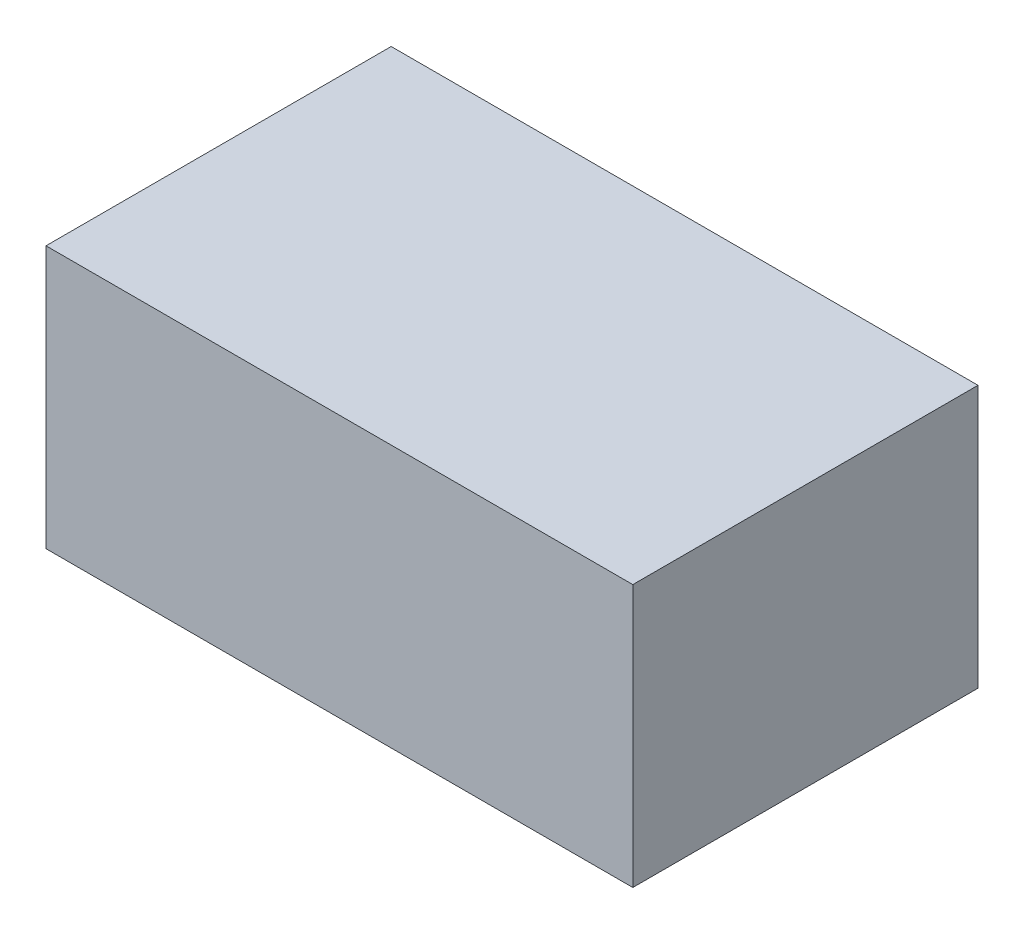
ISO-10303-21;
HEADER;
FILE_DESCRIPTION(('STEP AP214'),'2;1');
FILE_NAME('part.step','',(''),(''),'','','');
FILE_SCHEMA(('AUTOMOTIVE_DESIGN { 1 0 10303 214 1 1 1 1 }'));
ENDSEC;
DATA;
#1=APPLICATION_CONTEXT('core data for automotive mechanical design processes');
#2=APPLICATION_PROTOCOL_DEFINITION('international standard','automotive_design',2000,#1);
#3=PRODUCT_CONTEXT('',#1,'mechanical');
#4=PRODUCT('Part','Part','',(#3));
#5=PRODUCT_RELATED_PRODUCT_CATEGORY('part','',(#4));
#6=PRODUCT_DEFINITION_FORMATION('','',#4);
#7=PRODUCT_DEFINITION_CONTEXT('part definition',#1,'design');
#8=PRODUCT_DEFINITION('design','',#6,#7);
#9=PRODUCT_DEFINITION_SHAPE('','',#8);
#10=(LENGTH_UNIT() NAMED_UNIT(*) SI_UNIT(.MILLI.,.METRE.));
#11=(NAMED_UNIT(*) PLANE_ANGLE_UNIT() SI_UNIT($,.RADIAN.));
#12=(NAMED_UNIT(*) SI_UNIT($,.STERADIAN.) SOLID_ANGLE_UNIT());
#13=UNCERTAINTY_MEASURE_WITH_UNIT(LENGTH_MEASURE(1.E-05),#10,'distance_accuracy_value','');
#14=(GEOMETRIC_REPRESENTATION_CONTEXT(3) GLOBAL_UNCERTAINTY_ASSIGNED_CONTEXT((#13)) GLOBAL_UNIT_ASSIGNED_CONTEXT((#10,
#11,#12)) REPRESENTATION_CONTEXT('',''));
#15=CARTESIAN_POINT('',(0.,0.,0.));
#16=DIRECTION('',(0.,0.,1.));
#17=DIRECTION('',(1.,0.,0.));
#18=AXIS2_PLACEMENT_3D('',#15,#16,#17);
#19=CARTESIAN_POINT('',(0.,12.065,0.));
#20=DIRECTION('',(1.,0.,0.));
#21=DIRECTION('',(0.,0.,-1.));
#22=AXIS2_PLACEMENT_3D('',#19,#20,#21);
#23=PLANE('',#22);
#24=DIRECTION('',(0.,0.,1.));
#25=VECTOR('',#24,1.);
#26=CARTESIAN_POINT('',(0.,-12.065,0.));
#27=LINE('',#26,#25);
#28=CARTESIAN_POINT('',(0.,-12.065,-31.75));
#29=VERTEX_POINT('',#28);
#30=CARTESIAN_POINT('',(0.,-12.065,0.));
#31=VERTEX_POINT('',#30);
#32=EDGE_CURVE('E100',#29,#31,#27,.T.);
#33=ORIENTED_EDGE('',*,*,#32,.T.);
#34=DIRECTION('',(0.,-1.,0.));
#35=VECTOR('',#34,1.);
#36=CARTESIAN_POINT('',(0.,12.065,0.));
#37=LINE('',#36,#35);
#38=CARTESIAN_POINT('',(0.,12.065,0.));
#39=VERTEX_POINT('',#38);
#40=EDGE_CURVE('E11',#39,#31,#37,.T.);
#41=ORIENTED_EDGE('',*,*,#40,.F.);
#42=DIRECTION('',(0.,0.,1.));
#43=VECTOR('',#42,1.);
#44=CARTESIAN_POINT('',(0.,12.065,0.));
#45=LINE('',#44,#43);
#46=CARTESIAN_POINT('',(0.,12.065,-31.75));
#47=VERTEX_POINT('',#46);
#48=EDGE_CURVE('E88',#47,#39,#45,.T.);
#49=ORIENTED_EDGE('',*,*,#48,.F.);
#50=DIRECTION('',(0.,-1.,0.));
#51=VECTOR('',#50,1.);
#52=CARTESIAN_POINT('',(0.,12.065,-31.75));
#53=LINE('',#52,#51);
#54=EDGE_CURVE('E96',#47,#29,#53,.T.);
#55=ORIENTED_EDGE('',*,*,#54,.T.);
#56=EDGE_LOOP('',(#33,#41,#49,#55));
#57=FACE_BOUND('',#56,.T.);
#58=ADVANCED_FACE('F37',(#57),#23,.F.);
#59=CARTESIAN_POINT('',(0.,12.065,0.));
#60=DIRECTION('',(0.,0.,-1.));
#61=DIRECTION('',(-1.,0.,0.));
#62=AXIS2_PLACEMENT_3D('',#59,#60,#61);
#63=PLANE('',#62);
#64=DIRECTION('',(1.,0.,0.));
#65=VECTOR('',#64,1.);
#66=CARTESIAN_POINT('',(0.,-12.065,0.));
#67=LINE('',#66,#65);
#68=CARTESIAN_POINT('',(53.975,-12.065,0.));
#69=VERTEX_POINT('',#68);
#70=EDGE_CURVE('E92',#31,#69,#67,.T.);
#71=ORIENTED_EDGE('',*,*,#70,.T.);
#72=DIRECTION('',(0.,-1.,0.));
#73=VECTOR('',#72,1.);
#74=CARTESIAN_POINT('',(53.975,12.065,0.));
#75=LINE('',#74,#73);
#76=CARTESIAN_POINT('',(53.975,12.065,0.));
#77=VERTEX_POINT('',#76);
#78=EDGE_CURVE('E45',#77,#69,#75,.T.);
#79=ORIENTED_EDGE('',*,*,#78,.F.);
#80=DIRECTION('',(1.,0.,0.));
#81=VECTOR('',#80,1.);
#82=CARTESIAN_POINT('',(0.,12.065,0.));
#83=LINE('',#82,#81);
#84=EDGE_CURVE('E83',#39,#77,#83,.T.);
#85=ORIENTED_EDGE('',*,*,#84,.F.);
#86=ORIENTED_EDGE('',*,*,#40,.T.);
#87=EDGE_LOOP('',(#71,#79,#85,#86));
#88=FACE_BOUND('',#87,.T.);
#89=ADVANCED_FACE('F91',(#88),#63,.F.);
#90=CARTESIAN_POINT('',(53.975,12.065,0.));
#91=DIRECTION('',(-1.,0.,0.));
#92=DIRECTION('',(0.,0.,1.));
#93=AXIS2_PLACEMENT_3D('',#90,#91,#92);
#94=PLANE('',#93);
#95=DIRECTION('',(0.,0.,-1.));
#96=VECTOR('',#95,1.);
#97=CARTESIAN_POINT('',(53.975,-12.065,0.));
#98=LINE('',#97,#96);
#99=CARTESIAN_POINT('',(53.975,-12.065,-31.75));
#100=VERTEX_POINT('',#99);
#101=EDGE_CURVE('E70',#69,#100,#98,.T.);
#102=ORIENTED_EDGE('',*,*,#101,.T.);
#103=DIRECTION('',(0.,-1.,0.));
#104=VECTOR('',#103,1.);
#105=CARTESIAN_POINT('',(53.975,12.065,-31.75));
#106=LINE('',#105,#104);
#107=CARTESIAN_POINT('',(53.975,12.065,-31.75));
#108=VERTEX_POINT('',#107);
#109=EDGE_CURVE('E93',#108,#100,#106,.T.);
#110=ORIENTED_EDGE('',*,*,#109,.F.);
#111=DIRECTION('',(0.,0.,-1.));
#112=VECTOR('',#111,1.);
#113=CARTESIAN_POINT('',(53.975,12.065,0.));
#114=LINE('',#113,#112);
#115=EDGE_CURVE('E86',#77,#108,#114,.T.);
#116=ORIENTED_EDGE('',*,*,#115,.F.);
#117=ORIENTED_EDGE('',*,*,#78,.T.);
#118=EDGE_LOOP('',(#102,#110,#116,#117));
#119=FACE_BOUND('',#118,.T.);
#120=ADVANCED_FACE('F94',(#119),#94,.F.);
#121=CARTESIAN_POINT('',(0.,12.065,-31.75));
#122=DIRECTION('',(0.,0.,1.));
#123=DIRECTION('',(1.,0.,0.));
#124=AXIS2_PLACEMENT_3D('',#121,#122,#123);
#125=PLANE('',#124);
#126=DIRECTION('',(-1.,0.,0.));
#127=VECTOR('',#126,1.);
#128=CARTESIAN_POINT('',(0.,-12.065,-31.75));
#129=LINE('',#128,#127);
#130=EDGE_CURVE('E76',#100,#29,#129,.T.);
#131=ORIENTED_EDGE('',*,*,#130,.T.);
#132=ORIENTED_EDGE('',*,*,#54,.F.);
#133=DIRECTION('',(-1.,0.,0.));
#134=VECTOR('',#133,1.);
#135=CARTESIAN_POINT('',(0.,12.065,-31.75));
#136=LINE('',#135,#134);
#137=EDGE_CURVE('E53',#108,#47,#136,.T.);
#138=ORIENTED_EDGE('',*,*,#137,.F.);
#139=ORIENTED_EDGE('',*,*,#109,.T.);
#140=EDGE_LOOP('',(#131,#132,#138,#139));
#141=FACE_BOUND('',#140,.T.);
#142=ADVANCED_FACE('F107',(#141),#125,.F.);
#143=CARTESIAN_POINT('',(0.,12.065,0.));
#144=DIRECTION('',(0.,-1.,0.));
#145=DIRECTION('',(0.,0.,-1.));
#146=AXIS2_PLACEMENT_3D('',#143,#144,#145);
#147=PLANE('',#146);
#148=ORIENTED_EDGE('',*,*,#48,.T.);
#149=ORIENTED_EDGE('',*,*,#84,.T.);
#150=ORIENTED_EDGE('',*,*,#115,.T.);
#151=ORIENTED_EDGE('',*,*,#137,.T.);
#152=EDGE_LOOP('',(#148,#149,#150,#151));
#153=FACE_BOUND('',#152,.T.);
#154=ADVANCED_FACE('F84',(#153),#147,.F.);
#155=CARTESIAN_POINT('',(0.,-12.065,0.));
#156=DIRECTION('',(0.,-1.,0.));
#157=DIRECTION('',(0.,0.,-1.));
#158=AXIS2_PLACEMENT_3D('',#155,#156,#157);
#159=PLANE('',#158);
#160=ORIENTED_EDGE('',*,*,#32,.F.);
#161=ORIENTED_EDGE('',*,*,#130,.F.);
#162=ORIENTED_EDGE('',*,*,#101,.F.);
#163=ORIENTED_EDGE('',*,*,#70,.F.);
#164=EDGE_LOOP('',(#160,#161,#162,#163));
#165=FACE_BOUND('',#164,.T.);
#166=ADVANCED_FACE('F110',(#165),#159,.T.);
#167=CLOSED_SHELL('',(#58,#89,#120,#142,#154,#166));
#168=MANIFOLD_SOLID_BREP('B2',#167);
#169=ADVANCED_BREP_SHAPE_REPRESENTATION('',(#18,#168),#14);
#170=SHAPE_DEFINITION_REPRESENTATION(#9,#169);
ENDSEC;
END-ISO-10303-21;
